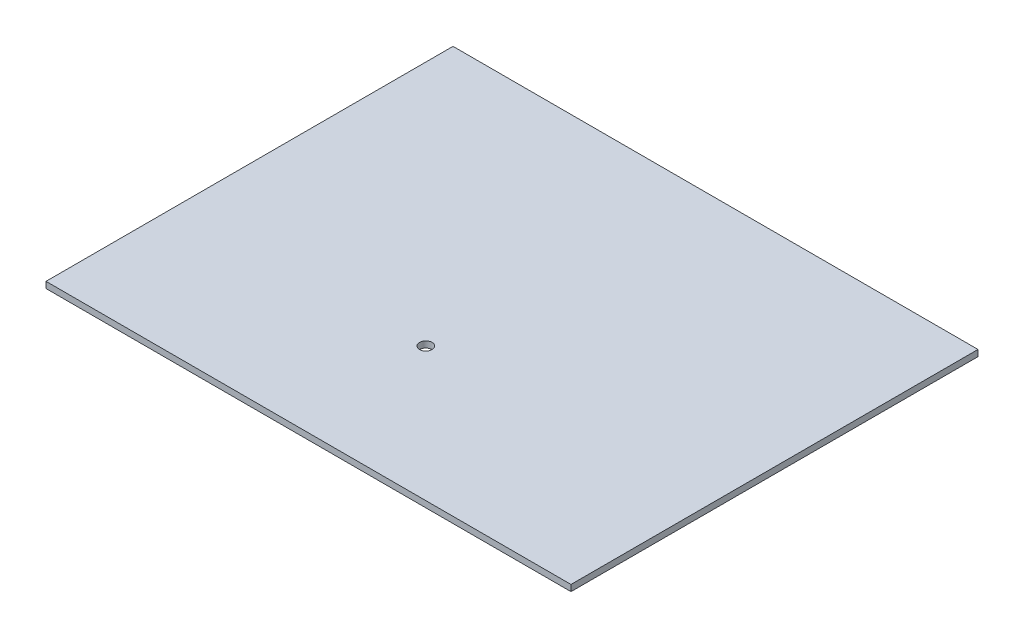
ISO-10303-21;
HEADER;
FILE_DESCRIPTION(('STEP AP214'),'2;1');
FILE_NAME('part.step','',(''),(''),'','','');
FILE_SCHEMA(('AUTOMOTIVE_DESIGN { 1 0 10303 214 1 1 1 1 }'));
ENDSEC;
DATA;
#1=APPLICATION_CONTEXT('core data for automotive mechanical design processes');
#2=APPLICATION_PROTOCOL_DEFINITION('international standard','automotive_design',2000,#1);
#3=PRODUCT_CONTEXT('',#1,'mechanical');
#4=PRODUCT('Part','Part','',(#3));
#5=PRODUCT_RELATED_PRODUCT_CATEGORY('part','',(#4));
#6=PRODUCT_DEFINITION_FORMATION('','',#4);
#7=PRODUCT_DEFINITION_CONTEXT('part definition',#1,'design');
#8=PRODUCT_DEFINITION('design','',#6,#7);
#9=PRODUCT_DEFINITION_SHAPE('','',#8);
#10=(LENGTH_UNIT() NAMED_UNIT(*) SI_UNIT(.MILLI.,.METRE.));
#11=(NAMED_UNIT(*) PLANE_ANGLE_UNIT() SI_UNIT($,.RADIAN.));
#12=(NAMED_UNIT(*) SI_UNIT($,.STERADIAN.) SOLID_ANGLE_UNIT());
#13=UNCERTAINTY_MEASURE_WITH_UNIT(LENGTH_MEASURE(1.E-05),#10,'distance_accuracy_value','');
#14=(GEOMETRIC_REPRESENTATION_CONTEXT(3) GLOBAL_UNCERTAINTY_ASSIGNED_CONTEXT((#13)) GLOBAL_UNIT_ASSIGNED_CONTEXT((#10,
#11,#12)) REPRESENTATION_CONTEXT('',''));
#15=CARTESIAN_POINT('',(0.,0.,0.));
#16=DIRECTION('',(0.,0.,1.));
#17=DIRECTION('',(1.,0.,0.));
#18=AXIS2_PLACEMENT_3D('',#15,#16,#17);
#19=CARTESIAN_POINT('',(0.,-16.9999999999974,0.));
#20=DIRECTION('',(0.,-1.,0.));
#21=DIRECTION('',(1.,0.,0.));
#22=AXIS2_PLACEMENT_3D('',#19,#20,#21);
#23=PLANE('',#22);
#24=CARTESIAN_POINT('',(33.5355452154016,-16.9999999999975,-12.7783533394967));
#25=DIRECTION('',(0.,-1.,0.));
#26=DIRECTION('',(1.,0.,0.));
#27=AXIS2_PLACEMENT_3D('',#24,#25,#26);
#28=CIRCLE('',#27,2.);
#29=CARTESIAN_POINT('',(35.5355452154016,-16.9999999999975,-12.7783533394967));
#30=VERTEX_POINT('',#29);
#31=EDGE_CURVE('E287',#30,#30,#28,.T.);
#32=ORIENTED_EDGE('',*,*,#31,.F.);
#33=EDGE_LOOP('',(#32));
#34=FACE_BOUND('',#33,.T.);
#35=DIRECTION('',(0.,0.,-1.));
#36=VECTOR('',#35,1.);
#37=CARTESIAN_POINT('',(-45.000000000006,-16.9999999999972,30.0000000000002));
#38=LINE('',#37,#36);
#39=CARTESIAN_POINT('',(-45.000000000006,-16.9999999999972,30.0000000000002));
#40=VERTEX_POINT('',#39);
#41=CARTESIAN_POINT('',(-45.0000000000059,-16.9999999999972,-99.9999999999998));
#42=VERTEX_POINT('',#41);
#43=EDGE_CURVE('E294',#40,#42,#38,.T.);
#44=ORIENTED_EDGE('',*,*,#43,.T.);
#45=DIRECTION('',(1.,0.,0.));
#46=VECTOR('',#45,1.);
#47=CARTESIAN_POINT('',(-45.0000000000059,-16.9999999999972,-99.9999999999998));
#48=LINE('',#47,#46);
#49=CARTESIAN_POINT('',(122.679999999994,-16.9999999999978,-99.9999999999998));
#50=VERTEX_POINT('',#49);
#51=EDGE_CURVE('E297',#42,#50,#48,.T.);
#52=ORIENTED_EDGE('',*,*,#51,.T.);
#53=DIRECTION('',(0.,0.,1.));
#54=VECTOR('',#53,1.);
#55=CARTESIAN_POINT('',(122.679999999995,-16.9999999999978,30.0000000000002));
#56=LINE('',#55,#54);
#57=CARTESIAN_POINT('',(122.679999999995,-16.9999999999978,30.0000000000002));
#58=VERTEX_POINT('',#57);
#59=EDGE_CURVE('E300',#50,#58,#56,.T.);
#60=ORIENTED_EDGE('',*,*,#59,.T.);
#61=DIRECTION('',(-1.,0.,0.));
#62=VECTOR('',#61,1.);
#63=CARTESIAN_POINT('',(-45.000000000006,-16.9999999999972,30.0000000000002));
#64=LINE('',#63,#62);
#65=EDGE_CURVE('E302',#58,#40,#64,.T.);
#66=ORIENTED_EDGE('',*,*,#65,.T.);
#67=EDGE_LOOP('',(#44,#52,#60,#66));
#68=FACE_BOUND('',#67,.T.);
#69=DIRECTION('',(1.,0.,0.));
#70=VECTOR('',#69,1.);
#71=CARTESIAN_POINT('',(-5.00000000000595,-16.9999999999974,-69.2756639537114));
#72=LINE('',#71,#70);
#73=CARTESIAN_POINT('',(-5.00000000000595,-16.9999999999974,-69.2756639537114));
#74=VERTEX_POINT('',#73);
#75=CARTESIAN_POINT('',(4.99999999999405,-16.9999999999974,-69.2756639537114));
#76=VERTEX_POINT('',#75);
#77=EDGE_CURVE('E272',#74,#76,#72,.T.);
#78=ORIENTED_EDGE('',*,*,#77,.F.);
#79=DIRECTION('',(0.,0.,-1.));
#80=VECTOR('',#79,1.);
#81=CARTESIAN_POINT('',(-5.00000000000596,-16.9999999999974,-49.5023552535735));
#82=LINE('',#81,#80);
#83=CARTESIAN_POINT('',(-5.00000000000596,-16.9999999999974,-49.5023552535735));
#84=VERTEX_POINT('',#83);
#85=EDGE_CURVE('E258',#84,#74,#82,.T.);
#86=ORIENTED_EDGE('',*,*,#85,.F.);
#87=DIRECTION('',(-1.,0.,0.));
#88=VECTOR('',#87,1.);
#89=CARTESIAN_POINT('',(-5.00000000000596,-16.9999999999974,-49.5023552535735));
#90=LINE('',#89,#88);
#91=CARTESIAN_POINT('',(4.99999999999404,-16.9999999999974,-49.5023552535735));
#92=VERTEX_POINT('',#91);
#93=EDGE_CURVE('E263',#92,#84,#90,.T.);
#94=ORIENTED_EDGE('',*,*,#93,.F.);
#95=DIRECTION('',(0.,0.,1.));
#96=VECTOR('',#95,1.);
#97=CARTESIAN_POINT('',(4.99999999999404,-16.9999999999974,-49.5023552535735));
#98=LINE('',#97,#96);
#99=EDGE_CURVE('E274',#76,#92,#98,.T.);
#100=ORIENTED_EDGE('',*,*,#99,.F.);
#101=EDGE_LOOP('',(#78,#86,#94,#100));
#102=FACE_BOUND('',#101,.T.);
#103=DIRECTION('',(1.,0.,0.));
#104=VECTOR('',#103,1.);
#105=CARTESIAN_POINT('',(19.999999999994,-16.9999999999975,-69.2756639537114));
#106=LINE('',#105,#104);
#107=CARTESIAN_POINT('',(19.999999999994,-16.9999999999975,-69.2756639537114));
#108=VERTEX_POINT('',#107);
#109=CARTESIAN_POINT('',(29.999999999994,-16.9999999999975,-69.2756639537114));
#110=VERTEX_POINT('',#109);
#111=EDGE_CURVE('E243',#108,#110,#106,.T.);
#112=ORIENTED_EDGE('',*,*,#111,.F.);
#113=DIRECTION('',(0.,0.,-1.));
#114=VECTOR('',#113,1.);
#115=CARTESIAN_POINT('',(19.999999999994,-16.9999999999975,-49.5023552535735));
#116=LINE('',#115,#114);
#117=CARTESIAN_POINT('',(19.999999999994,-16.9999999999975,-49.5023552535735));
#118=VERTEX_POINT('',#117);
#119=EDGE_CURVE('E229',#118,#108,#116,.T.);
#120=ORIENTED_EDGE('',*,*,#119,.F.);
#121=DIRECTION('',(-1.,0.,0.));
#122=VECTOR('',#121,1.);
#123=CARTESIAN_POINT('',(19.999999999994,-16.9999999999975,-49.5023552535735));
#124=LINE('',#123,#122);
#125=CARTESIAN_POINT('',(29.999999999994,-16.9999999999975,-49.5023552535735));
#126=VERTEX_POINT('',#125);
#127=EDGE_CURVE('E234',#126,#118,#124,.T.);
#128=ORIENTED_EDGE('',*,*,#127,.F.);
#129=DIRECTION('',(0.,0.,1.));
#130=VECTOR('',#129,1.);
#131=CARTESIAN_POINT('',(29.999999999994,-16.9999999999975,-49.5023552535735));
#132=LINE('',#131,#130);
#133=EDGE_CURVE('E245',#110,#126,#132,.T.);
#134=ORIENTED_EDGE('',*,*,#133,.F.);
#135=EDGE_LOOP('',(#112,#120,#128,#134));
#136=FACE_BOUND('',#135,.T.);
#137=DIRECTION('',(1.,0.,0.));
#138=VECTOR('',#137,1.);
#139=CARTESIAN_POINT('',(44.999999999994,-16.9999999999976,-69.2756639537114));
#140=LINE('',#139,#138);
#141=CARTESIAN_POINT('',(44.999999999994,-16.9999999999976,-69.2756639537114));
#142=VERTEX_POINT('',#141);
#143=CARTESIAN_POINT('',(54.999999999994,-16.9999999999976,-69.2756639537114));
#144=VERTEX_POINT('',#143);
#145=EDGE_CURVE('E201',#142,#144,#140,.T.);
#146=ORIENTED_EDGE('',*,*,#145,.F.);
#147=DIRECTION('',(0.,0.,-1.));
#148=VECTOR('',#147,1.);
#149=CARTESIAN_POINT('',(44.999999999994,-16.9999999999976,-49.5023552535735));
#150=LINE('',#149,#148);
#151=CARTESIAN_POINT('',(44.999999999994,-16.9999999999976,-49.5023552535735));
#152=VERTEX_POINT('',#151);
#153=EDGE_CURVE('E198',#152,#142,#150,.T.);
#154=ORIENTED_EDGE('',*,*,#153,.F.);
#155=DIRECTION('',(-1.,0.,0.));
#156=VECTOR('',#155,1.);
#157=CARTESIAN_POINT('',(44.999999999994,-16.9999999999976,-49.5023552535735));
#158=LINE('',#157,#156);
#159=CARTESIAN_POINT('',(54.999999999994,-16.9999999999976,-49.5023552535735));
#160=VERTEX_POINT('',#159);
#161=EDGE_CURVE('E210',#160,#152,#158,.T.);
#162=ORIENTED_EDGE('',*,*,#161,.F.);
#163=DIRECTION('',(0.,0.,1.));
#164=VECTOR('',#163,1.);
#165=CARTESIAN_POINT('',(54.999999999994,-16.9999999999976,-49.5023552535735));
#166=LINE('',#165,#164);
#167=EDGE_CURVE('E218',#144,#160,#166,.T.);
#168=ORIENTED_EDGE('',*,*,#167,.F.);
#169=EDGE_LOOP('',(#146,#154,#162,#168));
#170=FACE_BOUND('',#169,.T.);
#171=DIRECTION('',(1.,0.,0.));
#172=VECTOR('',#171,1.);
#173=CARTESIAN_POINT('',(69.9999999999941,-16.9999999999976,-69.2756639537114));
#174=LINE('',#173,#172);
#175=CARTESIAN_POINT('',(69.9999999999941,-16.9999999999976,-69.2756639537114));
#176=VERTEX_POINT('',#175);
#177=CARTESIAN_POINT('',(79.999999999994,-16.9999999999977,-69.2756639537114));
#178=VERTEX_POINT('',#177);
#179=EDGE_CURVE('E596',#176,#178,#174,.T.);
#180=ORIENTED_EDGE('',*,*,#179,.F.);
#181=DIRECTION('',(0.,0.,-1.));
#182=VECTOR('',#181,1.);
#183=CARTESIAN_POINT('',(69.9999999999941,-16.9999999999976,-49.5023552535735));
#184=LINE('',#183,#182);
#185=CARTESIAN_POINT('',(69.9999999999941,-16.9999999999976,-49.5023552535735));
#186=VERTEX_POINT('',#185);
#187=EDGE_CURVE('E196',#186,#176,#184,.T.);
#188=ORIENTED_EDGE('',*,*,#187,.F.);
#189=DIRECTION('',(-1.,0.,0.));
#190=VECTOR('',#189,1.);
#191=CARTESIAN_POINT('',(69.9999999999941,-16.9999999999976,-49.5023552535735));
#192=LINE('',#191,#190);
#193=CARTESIAN_POINT('',(79.999999999994,-16.9999999999977,-49.5023552535735));
#194=VERTEX_POINT('',#193);
#195=EDGE_CURVE('E192',#194,#186,#192,.T.);
#196=ORIENTED_EDGE('',*,*,#195,.F.);
#197=DIRECTION('',(0.,0.,1.));
#198=VECTOR('',#197,1.);
#199=CARTESIAN_POINT('',(79.999999999994,-16.9999999999977,-49.5023552535735));
#200=LINE('',#199,#198);
#201=EDGE_CURVE('E593',#178,#194,#200,.T.);
#202=ORIENTED_EDGE('',*,*,#201,.F.);
#203=EDGE_LOOP('',(#180,#188,#196,#202));
#204=FACE_BOUND('',#203,.T.);
#205=ADVANCED_FACE('F35',(#34,#68,#102,#136,#170,#204),#23,.T.);
#206=CARTESIAN_POINT('',(-45.000000000006,-16.9999999999972,30.0000000000002));
#207=DIRECTION('',(1.,0.,0.));
#208=DIRECTION('',(0.,1.,0.));
#209=AXIS2_PLACEMENT_3D('',#206,#207,#208);
#210=PLANE('',#209);
#211=DIRECTION('',(0.,0.,-1.));
#212=VECTOR('',#211,1.);
#213=CARTESIAN_POINT('',(-45.000000000006,-14.9999999999972,30.0000000000002));
#214=LINE('',#213,#212);
#215=CARTESIAN_POINT('',(-45.000000000006,-14.9999999999972,30.0000000000002));
#216=VERTEX_POINT('',#215);
#217=CARTESIAN_POINT('',(-45.0000000000059,-14.9999999999972,-99.9999999999998));
#218=VERTEX_POINT('',#217);
#219=EDGE_CURVE('E291',#216,#218,#214,.T.);
#220=ORIENTED_EDGE('',*,*,#219,.T.);
#221=DIRECTION('',(0.,1.,0.));
#222=VECTOR('',#221,1.);
#223=CARTESIAN_POINT('',(-45.0000000000059,-16.9999999999972,-99.9999999999998));
#224=LINE('',#223,#222);
#225=EDGE_CURVE('E11',#42,#218,#224,.T.);
#226=ORIENTED_EDGE('',*,*,#225,.F.);
#227=ORIENTED_EDGE('',*,*,#43,.F.);
#228=DIRECTION('',(0.,1.,0.));
#229=VECTOR('',#228,1.);
#230=CARTESIAN_POINT('',(-45.000000000006,-16.9999999999972,30.0000000000002));
#231=LINE('',#230,#229);
#232=EDGE_CURVE('E304',#40,#216,#231,.T.);
#233=ORIENTED_EDGE('',*,*,#232,.T.);
#234=EDGE_LOOP('',(#220,#226,#227,#233));
#235=FACE_BOUND('',#234,.T.);
#236=ADVANCED_FACE('F37',(#235),#210,.F.);
#237=CARTESIAN_POINT('',(-45.0000000000059,-16.9999999999972,-99.9999999999998));
#238=DIRECTION('',(0.,0.,1.));
#239=DIRECTION('',(0.,-1.,0.));
#240=AXIS2_PLACEMENT_3D('',#237,#238,#239);
#241=PLANE('',#240);
#242=DIRECTION('',(1.,0.,0.));
#243=VECTOR('',#242,1.);
#244=CARTESIAN_POINT('',(-45.0000000000059,-14.9999999999972,-99.9999999999998));
#245=LINE('',#244,#243);
#246=CARTESIAN_POINT('',(122.679999999994,-14.9999999999978,-99.9999999999998));
#247=VERTEX_POINT('',#246);
#248=EDGE_CURVE('E307',#218,#247,#245,.T.);
#249=ORIENTED_EDGE('',*,*,#248,.T.);
#250=DIRECTION('',(0.,1.,0.));
#251=VECTOR('',#250,1.);
#252=CARTESIAN_POINT('',(122.679999999994,-16.9999999999978,-99.9999999999998));
#253=LINE('',#252,#251);
#254=EDGE_CURVE('E43',#50,#247,#253,.T.);
#255=ORIENTED_EDGE('',*,*,#254,.F.);
#256=ORIENTED_EDGE('',*,*,#51,.F.);
#257=ORIENTED_EDGE('',*,*,#225,.T.);
#258=EDGE_LOOP('',(#249,#255,#256,#257));
#259=FACE_BOUND('',#258,.T.);
#260=ADVANCED_FACE('F337',(#259),#241,.F.);
#261=CARTESIAN_POINT('',(122.679999999995,-16.9999999999978,30.0000000000002));
#262=DIRECTION('',(-1.,0.,0.));
#263=DIRECTION('',(0.,-1.,0.));
#264=AXIS2_PLACEMENT_3D('',#261,#262,#263);
#265=PLANE('',#264);
#266=DIRECTION('',(0.,0.,1.));
#267=VECTOR('',#266,1.);
#268=CARTESIAN_POINT('',(122.679999999995,-14.9999999999978,30.0000000000002));
#269=LINE('',#268,#267);
#270=CARTESIAN_POINT('',(122.679999999995,-14.9999999999978,30.0000000000002));
#271=VERTEX_POINT('',#270);
#272=EDGE_CURVE('E309',#247,#271,#269,.T.);
#273=ORIENTED_EDGE('',*,*,#272,.T.);
#274=DIRECTION('',(0.,1.,0.));
#275=VECTOR('',#274,1.);
#276=CARTESIAN_POINT('',(122.679999999995,-16.9999999999978,30.0000000000002));
#277=LINE('',#276,#275);
#278=EDGE_CURVE('E314',#58,#271,#277,.T.);
#279=ORIENTED_EDGE('',*,*,#278,.F.);
#280=ORIENTED_EDGE('',*,*,#59,.F.);
#281=ORIENTED_EDGE('',*,*,#254,.T.);
#282=EDGE_LOOP('',(#273,#279,#280,#281));
#283=FACE_BOUND('',#282,.T.);
#284=ADVANCED_FACE('F321',(#283),#265,.F.);
#285=CARTESIAN_POINT('',(-45.000000000006,-16.9999999999972,30.0000000000002));
#286=DIRECTION('',(0.,0.,-1.));
#287=DIRECTION('',(0.,1.,0.));
#288=AXIS2_PLACEMENT_3D('',#285,#286,#287);
#289=PLANE('',#288);
#290=DIRECTION('',(-1.,0.,0.));
#291=VECTOR('',#290,1.);
#292=CARTESIAN_POINT('',(-45.000000000006,-14.9999999999972,30.0000000000002));
#293=LINE('',#292,#291);
#294=EDGE_CURVE('E298',#271,#216,#293,.T.);
#295=ORIENTED_EDGE('',*,*,#294,.T.);
#296=ORIENTED_EDGE('',*,*,#232,.F.);
#297=ORIENTED_EDGE('',*,*,#65,.F.);
#298=ORIENTED_EDGE('',*,*,#278,.T.);
#299=EDGE_LOOP('',(#295,#296,#297,#298));
#300=FACE_BOUND('',#299,.T.);
#301=ADVANCED_FACE('F330',(#300),#289,.F.);
#302=CARTESIAN_POINT('',(0.,-14.9999999999974,0.));
#303=DIRECTION('',(0.,-1.,0.));
#304=DIRECTION('',(1.,0.,0.));
#305=AXIS2_PLACEMENT_3D('',#302,#303,#304);
#306=PLANE('',#305);
#307=CARTESIAN_POINT('',(33.5355452154017,-14.9999999999975,-12.7783533394967));
#308=DIRECTION('',(0.,-1.,0.));
#309=DIRECTION('',(1.,0.,0.));
#310=AXIS2_PLACEMENT_3D('',#307,#308,#309);
#311=CIRCLE('',#310,2.);
#312=CARTESIAN_POINT('',(35.5355452154017,-14.9999999999975,-12.7783533394967));
#313=VERTEX_POINT('',#312);
#314=EDGE_CURVE('E288',#313,#313,#311,.T.);
#315=ORIENTED_EDGE('',*,*,#314,.T.);
#316=EDGE_LOOP('',(#315));
#317=FACE_BOUND('',#316,.T.);
#318=ORIENTED_EDGE('',*,*,#219,.F.);
#319=ORIENTED_EDGE('',*,*,#294,.F.);
#320=ORIENTED_EDGE('',*,*,#272,.F.);
#321=ORIENTED_EDGE('',*,*,#248,.F.);
#322=EDGE_LOOP('',(#318,#319,#320,#321));
#323=FACE_BOUND('',#322,.T.);
#324=ADVANCED_FACE('F327',(#317,#323),#306,.F.);
#325=CARTESIAN_POINT('',(33.5355452154017,-14.9999999999975,-12.7783533394967));
#326=DIRECTION('',(0.,-1.,0.));
#327=DIRECTION('',(1.,0.,0.));
#328=AXIS2_PLACEMENT_3D('',#325,#326,#327);
#329=CYLINDRICAL_SURFACE('',#328,2.);
#330=ORIENTED_EDGE('',*,*,#314,.F.);
#331=EDGE_LOOP('',(#330));
#332=FACE_BOUND('',#331,.T.);
#333=ORIENTED_EDGE('',*,*,#31,.T.);
#334=EDGE_LOOP('',(#333));
#335=FACE_BOUND('',#334,.T.);
#336=ADVANCED_FACE('F352',(#332,#335),#329,.F.);
#337=CARTESIAN_POINT('',(-5.00000000000597,-19.9999999999974,-49.5023552535735));
#338=DIRECTION('',(1.,0.,0.));
#339=DIRECTION('',(0.,1.,0.));
#340=AXIS2_PLACEMENT_3D('',#337,#338,#339);
#341=PLANE('',#340);
#342=ORIENTED_EDGE('',*,*,#85,.T.);
#343=DIRECTION('',(0.,1.,0.));
#344=VECTOR('',#343,1.);
#345=CARTESIAN_POINT('',(-5.00000000000596,-19.9999999999974,-69.2756639537114));
#346=LINE('',#345,#344);
#347=CARTESIAN_POINT('',(-5.00000000000596,-19.9999999999974,-69.2756639537114));
#348=VERTEX_POINT('',#347);
#349=EDGE_CURVE('E285',#348,#74,#346,.T.);
#350=ORIENTED_EDGE('',*,*,#349,.F.);
#351=DIRECTION('',(0.,0.,-1.));
#352=VECTOR('',#351,1.);
#353=CARTESIAN_POINT('',(-5.00000000000597,-19.9999999999974,-49.5023552535735));
#354=LINE('',#353,#352);
#355=CARTESIAN_POINT('',(-5.00000000000597,-19.9999999999974,-49.5023552535735));
#356=VERTEX_POINT('',#355);
#357=EDGE_CURVE('E259',#356,#348,#354,.T.);
#358=ORIENTED_EDGE('',*,*,#357,.F.);
#359=DIRECTION('',(0.,1.,0.));
#360=VECTOR('',#359,1.);
#361=CARTESIAN_POINT('',(-5.00000000000597,-19.9999999999974,-49.5023552535735));
#362=LINE('',#361,#360);
#363=EDGE_CURVE('E269',#356,#84,#362,.T.);
#364=ORIENTED_EDGE('',*,*,#363,.T.);
#365=EDGE_LOOP('',(#342,#350,#358,#364));
#366=FACE_BOUND('',#365,.T.);
#367=ADVANCED_FACE('F372',(#366),#341,.F.);
#368=CARTESIAN_POINT('',(-5.00000000000596,-19.9999999999974,-69.2756639537114));
#369=DIRECTION('',(0.,0.,1.));
#370=DIRECTION('',(0.,-1.,0.));
#371=AXIS2_PLACEMENT_3D('',#368,#369,#370);
#372=PLANE('',#371);
#373=ORIENTED_EDGE('',*,*,#77,.T.);
#374=DIRECTION('',(0.,1.,0.));
#375=VECTOR('',#374,1.);
#376=CARTESIAN_POINT('',(4.99999999999404,-19.9999999999974,-69.2756639537114));
#377=LINE('',#376,#375);
#378=CARTESIAN_POINT('',(4.99999999999404,-19.9999999999974,-69.2756639537114));
#379=VERTEX_POINT('',#378);
#380=EDGE_CURVE('E282',#379,#76,#377,.T.);
#381=ORIENTED_EDGE('',*,*,#380,.F.);
#382=DIRECTION('',(1.,0.,0.));
#383=VECTOR('',#382,1.);
#384=CARTESIAN_POINT('',(-5.00000000000596,-19.9999999999974,-69.2756639537114));
#385=LINE('',#384,#383);
#386=EDGE_CURVE('E262',#348,#379,#385,.T.);
#387=ORIENTED_EDGE('',*,*,#386,.F.);
#388=ORIENTED_EDGE('',*,*,#349,.T.);
#389=EDGE_LOOP('',(#373,#381,#387,#388));
#390=FACE_BOUND('',#389,.T.);
#391=ADVANCED_FACE('F379',(#390),#372,.F.);
#392=CARTESIAN_POINT('',(4.99999999999403,-19.9999999999974,-49.5023552535735));
#393=DIRECTION('',(-1.,0.,0.));
#394=DIRECTION('',(0.,-1.,0.));
#395=AXIS2_PLACEMENT_3D('',#392,#393,#394);
#396=PLANE('',#395);
#397=ORIENTED_EDGE('',*,*,#99,.T.);
#398=DIRECTION('',(0.,1.,0.));
#399=VECTOR('',#398,1.);
#400=CARTESIAN_POINT('',(4.99999999999403,-19.9999999999974,-49.5023552535735));
#401=LINE('',#400,#399);
#402=CARTESIAN_POINT('',(4.99999999999403,-19.9999999999974,-49.5023552535735));
#403=VERTEX_POINT('',#402);
#404=EDGE_CURVE('E280',#403,#92,#401,.T.);
#405=ORIENTED_EDGE('',*,*,#404,.F.);
#406=DIRECTION('',(0.,0.,1.));
#407=VECTOR('',#406,1.);
#408=CARTESIAN_POINT('',(4.99999999999403,-19.9999999999974,-49.5023552535735));
#409=LINE('',#408,#407);
#410=EDGE_CURVE('E265',#379,#403,#409,.T.);
#411=ORIENTED_EDGE('',*,*,#410,.F.);
#412=ORIENTED_EDGE('',*,*,#380,.T.);
#413=EDGE_LOOP('',(#397,#405,#411,#412));
#414=FACE_BOUND('',#413,.T.);
#415=ADVANCED_FACE('F386',(#414),#396,.F.);
#416=CARTESIAN_POINT('',(-5.00000000000597,-19.9999999999974,-49.5023552535735));
#417=DIRECTION('',(0.,0.,-1.));
#418=DIRECTION('',(0.,1.,0.));
#419=AXIS2_PLACEMENT_3D('',#416,#417,#418);
#420=PLANE('',#419);
#421=ORIENTED_EDGE('',*,*,#93,.T.);
#422=ORIENTED_EDGE('',*,*,#363,.F.);
#423=DIRECTION('',(-1.,0.,0.));
#424=VECTOR('',#423,1.);
#425=CARTESIAN_POINT('',(-5.00000000000597,-19.9999999999974,-49.5023552535735));
#426=LINE('',#425,#424);
#427=EDGE_CURVE('E267',#403,#356,#426,.T.);
#428=ORIENTED_EDGE('',*,*,#427,.F.);
#429=ORIENTED_EDGE('',*,*,#404,.T.);
#430=EDGE_LOOP('',(#421,#422,#428,#429));
#431=FACE_BOUND('',#430,.T.);
#432=ADVANCED_FACE('F394',(#431),#420,.F.);
#433=CARTESIAN_POINT('',(0.,-19.9999999999974,0.));
#434=DIRECTION('',(0.,-1.,0.));
#435=DIRECTION('',(1.,0.,0.));
#436=AXIS2_PLACEMENT_3D('',#433,#434,#435);
#437=PLANE('',#436);
#438=ORIENTED_EDGE('',*,*,#357,.T.);
#439=ORIENTED_EDGE('',*,*,#386,.T.);
#440=ORIENTED_EDGE('',*,*,#410,.T.);
#441=ORIENTED_EDGE('',*,*,#427,.T.);
#442=EDGE_LOOP('',(#438,#439,#440,#441));
#443=FACE_BOUND('',#442,.T.);
#444=ADVANCED_FACE('F402',(#443),#437,.T.);
#445=CARTESIAN_POINT('',(19.999999999994,-19.9999999999975,-49.5023552535735));
#446=DIRECTION('',(1.,0.,0.));
#447=DIRECTION('',(0.,1.,0.));
#448=AXIS2_PLACEMENT_3D('',#445,#446,#447);
#449=PLANE('',#448);
#450=ORIENTED_EDGE('',*,*,#119,.T.);
#451=DIRECTION('',(0.,1.,0.));
#452=VECTOR('',#451,1.);
#453=CARTESIAN_POINT('',(19.999999999994,-19.9999999999975,-69.2756639537114));
#454=LINE('',#453,#452);
#455=CARTESIAN_POINT('',(19.999999999994,-19.9999999999975,-69.2756639537114));
#456=VERTEX_POINT('',#455);
#457=EDGE_CURVE('E256',#456,#108,#454,.T.);
#458=ORIENTED_EDGE('',*,*,#457,.F.);
#459=DIRECTION('',(0.,0.,-1.));
#460=VECTOR('',#459,1.);
#461=CARTESIAN_POINT('',(19.999999999994,-19.9999999999975,-49.5023552535735));
#462=LINE('',#461,#460);
#463=CARTESIAN_POINT('',(19.999999999994,-19.9999999999975,-49.5023552535735));
#464=VERTEX_POINT('',#463);
#465=EDGE_CURVE('E230',#464,#456,#462,.T.);
#466=ORIENTED_EDGE('',*,*,#465,.F.);
#467=DIRECTION('',(0.,1.,0.));
#468=VECTOR('',#467,1.);
#469=CARTESIAN_POINT('',(19.999999999994,-19.9999999999975,-49.5023552535735));
#470=LINE('',#469,#468);
#471=EDGE_CURVE('E240',#464,#118,#470,.T.);
#472=ORIENTED_EDGE('',*,*,#471,.T.);
#473=EDGE_LOOP('',(#450,#458,#466,#472));
#474=FACE_BOUND('',#473,.T.);
#475=ADVANCED_FACE('F410',(#474),#449,.F.);
#476=CARTESIAN_POINT('',(19.999999999994,-19.9999999999975,-69.2756639537114));
#477=DIRECTION('',(0.,0.,1.));
#478=DIRECTION('',(0.,-1.,0.));
#479=AXIS2_PLACEMENT_3D('',#476,#477,#478);
#480=PLANE('',#479);
#481=ORIENTED_EDGE('',*,*,#111,.T.);
#482=DIRECTION('',(0.,1.,0.));
#483=VECTOR('',#482,1.);
#484=CARTESIAN_POINT('',(29.999999999994,-19.9999999999975,-69.2756639537114));
#485=LINE('',#484,#483);
#486=CARTESIAN_POINT('',(29.999999999994,-19.9999999999975,-69.2756639537114));
#487=VERTEX_POINT('',#486);
#488=EDGE_CURVE('E253',#487,#110,#485,.T.);
#489=ORIENTED_EDGE('',*,*,#488,.F.);
#490=DIRECTION('',(1.,0.,0.));
#491=VECTOR('',#490,1.);
#492=CARTESIAN_POINT('',(19.999999999994,-19.9999999999975,-69.2756639537114));
#493=LINE('',#492,#491);
#494=EDGE_CURVE('E233',#456,#487,#493,.T.);
#495=ORIENTED_EDGE('',*,*,#494,.F.);
#496=ORIENTED_EDGE('',*,*,#457,.T.);
#497=EDGE_LOOP('',(#481,#489,#495,#496));
#498=FACE_BOUND('',#497,.T.);
#499=ADVANCED_FACE('F418',(#498),#480,.F.);
#500=CARTESIAN_POINT('',(29.999999999994,-19.9999999999975,-49.5023552535735));
#501=DIRECTION('',(-1.,0.,0.));
#502=DIRECTION('',(0.,-1.,0.));
#503=AXIS2_PLACEMENT_3D('',#500,#501,#502);
#504=PLANE('',#503);
#505=ORIENTED_EDGE('',*,*,#133,.T.);
#506=DIRECTION('',(0.,1.,0.));
#507=VECTOR('',#506,1.);
#508=CARTESIAN_POINT('',(29.999999999994,-19.9999999999975,-49.5023552535735));
#509=LINE('',#508,#507);
#510=CARTESIAN_POINT('',(29.999999999994,-19.9999999999975,-49.5023552535735));
#511=VERTEX_POINT('',#510);
#512=EDGE_CURVE('E251',#511,#126,#509,.T.);
#513=ORIENTED_EDGE('',*,*,#512,.F.);
#514=DIRECTION('',(0.,0.,1.));
#515=VECTOR('',#514,1.);
#516=CARTESIAN_POINT('',(29.999999999994,-19.9999999999975,-49.5023552535735));
#517=LINE('',#516,#515);
#518=EDGE_CURVE('E236',#487,#511,#517,.T.);
#519=ORIENTED_EDGE('',*,*,#518,.F.);
#520=ORIENTED_EDGE('',*,*,#488,.T.);
#521=EDGE_LOOP('',(#505,#513,#519,#520));
#522=FACE_BOUND('',#521,.T.);
#523=ADVANCED_FACE('F426',(#522),#504,.F.);
#524=CARTESIAN_POINT('',(19.999999999994,-19.9999999999975,-49.5023552535735));
#525=DIRECTION('',(0.,0.,-1.));
#526=DIRECTION('',(-1.,0.,0.));
#527=AXIS2_PLACEMENT_3D('',#524,#525,#526);
#528=PLANE('',#527);
#529=ORIENTED_EDGE('',*,*,#127,.T.);
#530=ORIENTED_EDGE('',*,*,#471,.F.);
#531=DIRECTION('',(-1.,0.,0.));
#532=VECTOR('',#531,1.);
#533=CARTESIAN_POINT('',(19.999999999994,-19.9999999999975,-49.5023552535735));
#534=LINE('',#533,#532);
#535=EDGE_CURVE('E238',#511,#464,#534,.T.);
#536=ORIENTED_EDGE('',*,*,#535,.F.);
#537=ORIENTED_EDGE('',*,*,#512,.T.);
#538=EDGE_LOOP('',(#529,#530,#536,#537));
#539=FACE_BOUND('',#538,.T.);
#540=ADVANCED_FACE('F434',(#539),#528,.F.);
#541=CARTESIAN_POINT('',(0.,-19.9999999999974,0.));
#542=DIRECTION('',(0.,-1.,0.));
#543=DIRECTION('',(1.,0.,0.));
#544=AXIS2_PLACEMENT_3D('',#541,#542,#543);
#545=PLANE('',#544);
#546=ORIENTED_EDGE('',*,*,#465,.T.);
#547=ORIENTED_EDGE('',*,*,#494,.T.);
#548=ORIENTED_EDGE('',*,*,#518,.T.);
#549=ORIENTED_EDGE('',*,*,#535,.T.);
#550=EDGE_LOOP('',(#546,#547,#548,#549));
#551=FACE_BOUND('',#550,.T.);
#552=ADVANCED_FACE('F442',(#551),#545,.T.);
#553=CARTESIAN_POINT('',(44.999999999994,-19.9999999999976,-49.5023552535735));
#554=DIRECTION('',(1.,0.,0.));
#555=DIRECTION('',(0.,1.,0.));
#556=AXIS2_PLACEMENT_3D('',#553,#554,#555);
#557=PLANE('',#556);
#558=ORIENTED_EDGE('',*,*,#153,.T.);
#559=DIRECTION('',(0.,1.,0.));
#560=VECTOR('',#559,1.);
#561=CARTESIAN_POINT('',(44.999999999994,-19.9999999999976,-69.2756639537114));
#562=LINE('',#561,#560);
#563=CARTESIAN_POINT('',(44.999999999994,-19.9999999999976,-69.2756639537114));
#564=VERTEX_POINT('',#563);
#565=EDGE_CURVE('E227',#564,#142,#562,.T.);
#566=ORIENTED_EDGE('',*,*,#565,.F.);
#567=DIRECTION('',(0.,0.,-1.));
#568=VECTOR('',#567,1.);
#569=CARTESIAN_POINT('',(44.999999999994,-19.9999999999976,-49.5023552535735));
#570=LINE('',#569,#568);
#571=CARTESIAN_POINT('',(44.999999999994,-19.9999999999976,-49.5023552535735));
#572=VERTEX_POINT('',#571);
#573=EDGE_CURVE('E206',#572,#564,#570,.T.);
#574=ORIENTED_EDGE('',*,*,#573,.F.);
#575=DIRECTION('',(0.,1.,0.));
#576=VECTOR('',#575,1.);
#577=CARTESIAN_POINT('',(44.999999999994,-19.9999999999976,-49.5023552535735));
#578=LINE('',#577,#576);
#579=EDGE_CURVE('E215',#572,#152,#578,.T.);
#580=ORIENTED_EDGE('',*,*,#579,.T.);
#581=EDGE_LOOP('',(#558,#566,#574,#580));
#582=FACE_BOUND('',#581,.T.);
#583=ADVANCED_FACE('F450',(#582),#557,.F.);
#584=CARTESIAN_POINT('',(44.999999999994,-19.9999999999976,-69.2756639537114));
#585=DIRECTION('',(0.,0.,1.));
#586=DIRECTION('',(0.,-1.,0.));
#587=AXIS2_PLACEMENT_3D('',#584,#585,#586);
#588=PLANE('',#587);
#589=ORIENTED_EDGE('',*,*,#145,.T.);
#590=DIRECTION('',(0.,1.,0.));
#591=VECTOR('',#590,1.);
#592=CARTESIAN_POINT('',(54.999999999994,-19.9999999999976,-69.2756639537114));
#593=LINE('',#592,#591);
#594=CARTESIAN_POINT('',(54.999999999994,-19.9999999999976,-69.2756639537114));
#595=VERTEX_POINT('',#594);
#596=EDGE_CURVE('E224',#595,#144,#593,.T.);
#597=ORIENTED_EDGE('',*,*,#596,.F.);
#598=DIRECTION('',(1.,0.,0.));
#599=VECTOR('',#598,1.);
#600=CARTESIAN_POINT('',(44.999999999994,-19.9999999999976,-69.2756639537114));
#601=LINE('',#600,#599);
#602=EDGE_CURVE('E209',#564,#595,#601,.T.);
#603=ORIENTED_EDGE('',*,*,#602,.F.);
#604=ORIENTED_EDGE('',*,*,#565,.T.);
#605=EDGE_LOOP('',(#589,#597,#603,#604));
#606=FACE_BOUND('',#605,.T.);
#607=ADVANCED_FACE('F458',(#606),#588,.F.);
#608=CARTESIAN_POINT('',(54.999999999994,-19.9999999999976,-49.5023552535735));
#609=DIRECTION('',(-1.,0.,0.));
#610=DIRECTION('',(0.,-1.,0.));
#611=AXIS2_PLACEMENT_3D('',#608,#609,#610);
#612=PLANE('',#611);
#613=ORIENTED_EDGE('',*,*,#167,.T.);
#614=DIRECTION('',(0.,1.,0.));
#615=VECTOR('',#614,1.);
#616=CARTESIAN_POINT('',(54.999999999994,-19.9999999999976,-49.5023552535735));
#617=LINE('',#616,#615);
#618=CARTESIAN_POINT('',(54.999999999994,-19.9999999999976,-49.5023552535735));
#619=VERTEX_POINT('',#618);
#620=EDGE_CURVE('E58',#619,#160,#617,.T.);
#621=ORIENTED_EDGE('',*,*,#620,.F.);
#622=DIRECTION('',(0.,0.,1.));
#623=VECTOR('',#622,1.);
#624=CARTESIAN_POINT('',(54.999999999994,-19.9999999999976,-49.5023552535735));
#625=LINE('',#624,#623);
#626=EDGE_CURVE('E212',#595,#619,#625,.T.);
#627=ORIENTED_EDGE('',*,*,#626,.F.);
#628=ORIENTED_EDGE('',*,*,#596,.T.);
#629=EDGE_LOOP('',(#613,#621,#627,#628));
#630=FACE_BOUND('',#629,.T.);
#631=ADVANCED_FACE('F466',(#630),#612,.F.);
#632=CARTESIAN_POINT('',(44.999999999994,-19.9999999999976,-49.5023552535735));
#633=DIRECTION('',(0.,0.,-1.));
#634=DIRECTION('',(0.,1.,0.));
#635=AXIS2_PLACEMENT_3D('',#632,#633,#634);
#636=PLANE('',#635);
#637=ORIENTED_EDGE('',*,*,#161,.T.);
#638=ORIENTED_EDGE('',*,*,#579,.F.);
#639=DIRECTION('',(-1.,0.,0.));
#640=VECTOR('',#639,1.);
#641=CARTESIAN_POINT('',(44.999999999994,-19.9999999999976,-49.5023552535735));
#642=LINE('',#641,#640);
#643=EDGE_CURVE('E214',#619,#572,#642,.T.);
#644=ORIENTED_EDGE('',*,*,#643,.F.);
#645=ORIENTED_EDGE('',*,*,#620,.T.);
#646=EDGE_LOOP('',(#637,#638,#644,#645));
#647=FACE_BOUND('',#646,.T.);
#648=ADVANCED_FACE('F474',(#647),#636,.F.);
#649=CARTESIAN_POINT('',(0.,-19.9999999999974,0.));
#650=DIRECTION('',(0.,-1.,0.));
#651=DIRECTION('',(1.,0.,0.));
#652=AXIS2_PLACEMENT_3D('',#649,#650,#651);
#653=PLANE('',#652);
#654=ORIENTED_EDGE('',*,*,#573,.T.);
#655=ORIENTED_EDGE('',*,*,#602,.T.);
#656=ORIENTED_EDGE('',*,*,#626,.T.);
#657=ORIENTED_EDGE('',*,*,#643,.T.);
#658=EDGE_LOOP('',(#654,#655,#656,#657));
#659=FACE_BOUND('',#658,.T.);
#660=ADVANCED_FACE('F482',(#659),#653,.T.);
#661=CARTESIAN_POINT('',(69.999999999994,-19.9999999999976,-49.5023552535735));
#662=DIRECTION('',(1.,0.,0.));
#663=DIRECTION('',(0.,1.,0.));
#664=AXIS2_PLACEMENT_3D('',#661,#662,#663);
#665=PLANE('',#664);
#666=ORIENTED_EDGE('',*,*,#187,.T.);
#667=DIRECTION('',(0.,1.,0.));
#668=VECTOR('',#667,1.);
#669=CARTESIAN_POINT('',(69.999999999994,-19.9999999999976,-69.2756639537114));
#670=LINE('',#669,#668);
#671=CARTESIAN_POINT('',(69.999999999994,-19.9999999999976,-69.2756639537114));
#672=VERTEX_POINT('',#671);
#673=EDGE_CURVE('E177',#672,#176,#670,.T.);
#674=ORIENTED_EDGE('',*,*,#673,.F.);
#675=DIRECTION('',(0.,0.,-1.));
#676=VECTOR('',#675,1.);
#677=CARTESIAN_POINT('',(69.999999999994,-19.9999999999976,-49.5023552535735));
#678=LINE('',#677,#676);
#679=CARTESIAN_POINT('',(69.999999999994,-19.9999999999976,-49.5023552535735));
#680=VERTEX_POINT('',#679);
#681=EDGE_CURVE('E184',#680,#672,#678,.T.);
#682=ORIENTED_EDGE('',*,*,#681,.F.);
#683=DIRECTION('',(0.,1.,0.));
#684=VECTOR('',#683,1.);
#685=CARTESIAN_POINT('',(69.999999999994,-19.9999999999976,-49.5023552535735));
#686=LINE('',#685,#684);
#687=EDGE_CURVE('E590',#680,#186,#686,.T.);
#688=ORIENTED_EDGE('',*,*,#687,.T.);
#689=EDGE_LOOP('',(#666,#674,#682,#688));
#690=FACE_BOUND('',#689,.T.);
#691=ADVANCED_FACE('F194',(#690),#665,.F.);
#692=CARTESIAN_POINT('',(69.999999999994,-19.9999999999976,-69.2756639537114));
#693=DIRECTION('',(0.,0.,1.));
#694=DIRECTION('',(0.,-1.,0.));
#695=AXIS2_PLACEMENT_3D('',#692,#693,#694);
#696=PLANE('',#695);
#697=ORIENTED_EDGE('',*,*,#179,.T.);
#698=DIRECTION('',(0.,1.,0.));
#699=VECTOR('',#698,1.);
#700=CARTESIAN_POINT('',(79.999999999994,-19.9999999999977,-69.2756639537114));
#701=LINE('',#700,#699);
#702=CARTESIAN_POINT('',(79.999999999994,-19.9999999999977,-69.2756639537114));
#703=VERTEX_POINT('',#702);
#704=EDGE_CURVE('E180',#703,#178,#701,.T.);
#705=ORIENTED_EDGE('',*,*,#704,.F.);
#706=DIRECTION('',(1.,0.,0.));
#707=VECTOR('',#706,1.);
#708=CARTESIAN_POINT('',(69.999999999994,-19.9999999999976,-69.2756639537114));
#709=LINE('',#708,#707);
#710=EDGE_CURVE('E173',#672,#703,#709,.T.);
#711=ORIENTED_EDGE('',*,*,#710,.F.);
#712=ORIENTED_EDGE('',*,*,#673,.T.);
#713=EDGE_LOOP('',(#697,#705,#711,#712));
#714=FACE_BOUND('',#713,.T.);
#715=ADVANCED_FACE('F175',(#714),#696,.F.);
#716=CARTESIAN_POINT('',(79.999999999994,-19.9999999999977,-49.5023552535735));
#717=DIRECTION('',(-1.,0.,0.));
#718=DIRECTION('',(0.,-1.,0.));
#719=AXIS2_PLACEMENT_3D('',#716,#717,#718);
#720=PLANE('',#719);
#721=ORIENTED_EDGE('',*,*,#201,.T.);
#722=DIRECTION('',(0.,1.,0.));
#723=VECTOR('',#722,1.);
#724=CARTESIAN_POINT('',(79.999999999994,-19.9999999999977,-49.5023552535735));
#725=LINE('',#724,#723);
#726=CARTESIAN_POINT('',(79.999999999994,-19.9999999999977,-49.5023552535735));
#727=VERTEX_POINT('',#726);
#728=EDGE_CURVE('E50',#727,#194,#725,.T.);
#729=ORIENTED_EDGE('',*,*,#728,.F.);
#730=DIRECTION('',(0.,0.,1.));
#731=VECTOR('',#730,1.);
#732=CARTESIAN_POINT('',(79.999999999994,-19.9999999999977,-49.5023552535735));
#733=LINE('',#732,#731);
#734=EDGE_CURVE('E183',#703,#727,#733,.T.);
#735=ORIENTED_EDGE('',*,*,#734,.F.);
#736=ORIENTED_EDGE('',*,*,#704,.T.);
#737=EDGE_LOOP('',(#721,#729,#735,#736));
#738=FACE_BOUND('',#737,.T.);
#739=ADVANCED_FACE('F502',(#738),#720,.F.);
#740=CARTESIAN_POINT('',(69.999999999994,-19.9999999999976,-49.5023552535735));
#741=DIRECTION('',(0.,0.,-1.));
#742=DIRECTION('',(-1.,0.,0.));
#743=AXIS2_PLACEMENT_3D('',#740,#741,#742);
#744=PLANE('',#743);
#745=ORIENTED_EDGE('',*,*,#195,.T.);
#746=ORIENTED_EDGE('',*,*,#687,.F.);
#747=DIRECTION('',(-1.,0.,0.));
#748=VECTOR('',#747,1.);
#749=CARTESIAN_POINT('',(69.999999999994,-19.9999999999976,-49.5023552535735));
#750=LINE('',#749,#748);
#751=EDGE_CURVE('E188',#727,#680,#750,.T.);
#752=ORIENTED_EDGE('',*,*,#751,.F.);
#753=ORIENTED_EDGE('',*,*,#728,.T.);
#754=EDGE_LOOP('',(#745,#746,#752,#753));
#755=FACE_BOUND('',#754,.T.);
#756=ADVANCED_FACE('F509',(#755),#744,.F.);
#757=CARTESIAN_POINT('',(0.,-19.9999999999974,0.));
#758=DIRECTION('',(0.,-1.,0.));
#759=DIRECTION('',(1.,0.,0.));
#760=AXIS2_PLACEMENT_3D('',#757,#758,#759);
#761=PLANE('',#760);
#762=ORIENTED_EDGE('',*,*,#681,.T.);
#763=ORIENTED_EDGE('',*,*,#710,.T.);
#764=ORIENTED_EDGE('',*,*,#734,.T.);
#765=ORIENTED_EDGE('',*,*,#751,.T.);
#766=EDGE_LOOP('',(#762,#763,#764,#765));
#767=FACE_BOUND('',#766,.T.);
#768=ADVANCED_FACE('F187',(#767),#761,.T.);
#769=CLOSED_SHELL('',(#205,#236,#260,#284,#301,#324,#336,#367,#391,#415,#432,#444,#475,#499,
#523,#540,#552,#583,#607,#631,#648,#660,#691,#715,#739,#756,#768));
#770=MANIFOLD_SOLID_BREP('B2',#769);
#771=ADVANCED_BREP_SHAPE_REPRESENTATION('',(#18,#770),#14);
#772=SHAPE_DEFINITION_REPRESENTATION(#9,#771);
ENDSEC;
END-ISO-10303-21;
